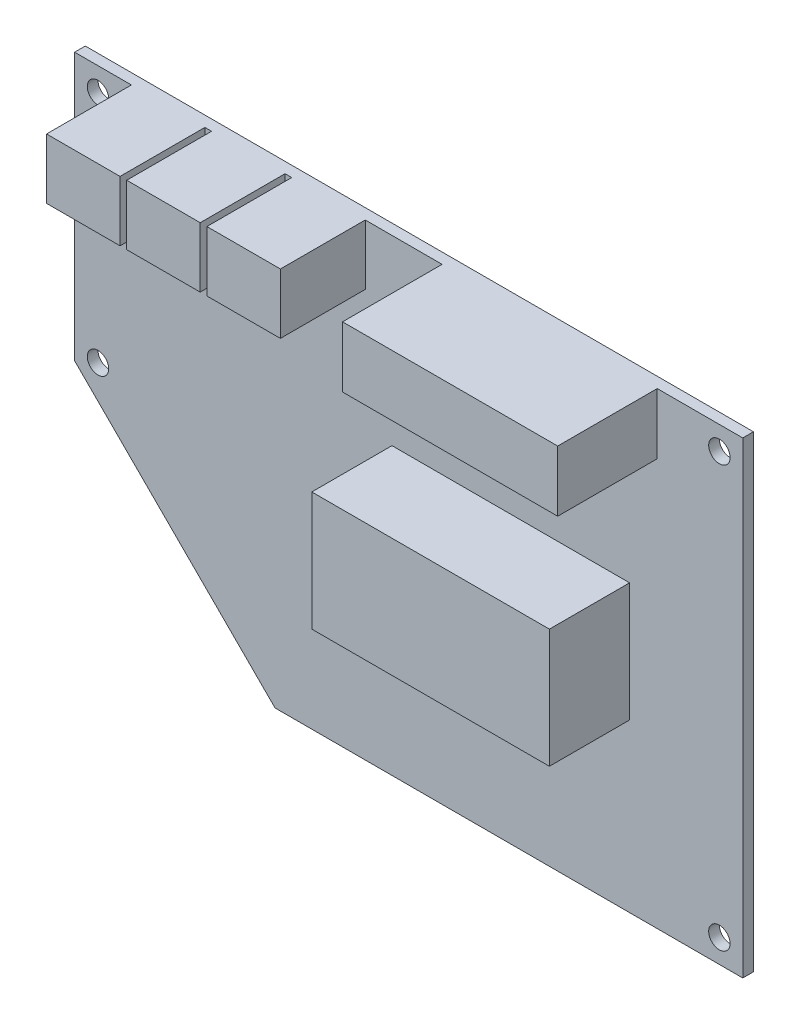
ISO-10303-21;
HEADER;
FILE_DESCRIPTION(('STEP AP214'),'2;1');
FILE_NAME('part.step','',(''),(''),'','','');
FILE_SCHEMA(('AUTOMOTIVE_DESIGN { 1 0 10303 214 1 1 1 1 }'));
ENDSEC;
DATA;
#1=APPLICATION_CONTEXT('core data for automotive mechanical design processes');
#2=APPLICATION_PROTOCOL_DEFINITION('international standard','automotive_design',2000,#1);
#3=PRODUCT_CONTEXT('',#1,'mechanical');
#4=PRODUCT('Part','Part','',(#3));
#5=PRODUCT_RELATED_PRODUCT_CATEGORY('part','',(#4));
#6=PRODUCT_DEFINITION_FORMATION('','',#4);
#7=PRODUCT_DEFINITION_CONTEXT('part definition',#1,'design');
#8=PRODUCT_DEFINITION('design','',#6,#7);
#9=PRODUCT_DEFINITION_SHAPE('','',#8);
#10=(LENGTH_UNIT() NAMED_UNIT(*) SI_UNIT(.MILLI.,.METRE.));
#11=(NAMED_UNIT(*) PLANE_ANGLE_UNIT() SI_UNIT($,.RADIAN.));
#12=(NAMED_UNIT(*) SI_UNIT($,.STERADIAN.) SOLID_ANGLE_UNIT());
#13=UNCERTAINTY_MEASURE_WITH_UNIT(LENGTH_MEASURE(1.E-05),#10,'distance_accuracy_value','');
#14=(GEOMETRIC_REPRESENTATION_CONTEXT(3) GLOBAL_UNCERTAINTY_ASSIGNED_CONTEXT((#13)) GLOBAL_UNIT_ASSIGNED_CONTEXT((#10,
#11,#12)) REPRESENTATION_CONTEXT('',''));
#15=CARTESIAN_POINT('',(0.,0.,0.));
#16=DIRECTION('',(0.,0.,1.));
#17=DIRECTION('',(1.,0.,0.));
#18=AXIS2_PLACEMENT_3D('',#15,#16,#17);
#19=CARTESIAN_POINT('',(0.,0.,1.6));
#20=DIRECTION('',(0.,0.,-1.));
#21=DIRECTION('',(-1.,0.,0.));
#22=AXIS2_PLACEMENT_3D('',#19,#20,#21);
#23=PLANE('',#22);
#24=DIRECTION('',(0.,-1.,0.));
#25=VECTOR('',#24,1.);
#26=CARTESIAN_POINT('',(55.,0.,1.6));
#27=LINE('',#26,#25);
#28=CARTESIAN_POINT('',(55.,0.,1.6));
#29=VERTEX_POINT('',#28);
#30=CARTESIAN_POINT('',(55.,-9.1,1.6));
#31=VERTEX_POINT('',#30);
#32=EDGE_CURVE('E231',#29,#31,#27,.T.);
#33=ORIENTED_EDGE('',*,*,#32,.F.);
#34=DIRECTION('',(-1.,0.,0.));
#35=VECTOR('',#34,1.);
#36=CARTESIAN_POINT('',(0.,0.,1.6));
#37=LINE('',#36,#35);
#38=CARTESIAN_POINT('',(43.5,0.,1.6));
#39=VERTEX_POINT('',#38);
#40=EDGE_CURVE('E453',#29,#39,#37,.T.);
#41=ORIENTED_EDGE('',*,*,#40,.T.);
#42=DIRECTION('',(0.,1.,0.));
#43=VECTOR('',#42,1.);
#44=CARTESIAN_POINT('',(43.5,0.,1.6));
#45=LINE('',#44,#43);
#46=CARTESIAN_POINT('',(43.5,-8.99999999999998,1.6));
#47=VERTEX_POINT('',#46);
#48=EDGE_CURVE('E284',#47,#39,#45,.T.);
#49=ORIENTED_EDGE('',*,*,#48,.F.);
#50=DIRECTION('',(1.,0.,0.));
#51=VECTOR('',#50,1.);
#52=CARTESIAN_POINT('',(32.5,-8.99999999999998,1.6));
#53=LINE('',#52,#51);
#54=CARTESIAN_POINT('',(32.5,-8.99999999999998,1.6));
#55=VERTEX_POINT('',#54);
#56=EDGE_CURVE('E297',#55,#47,#53,.T.);
#57=ORIENTED_EDGE('',*,*,#56,.F.);
#58=DIRECTION('',(0.,-1.,0.));
#59=VECTOR('',#58,1.);
#60=CARTESIAN_POINT('',(32.5,0.,1.6));
#61=LINE('',#60,#59);
#62=CARTESIAN_POINT('',(32.5,0.,1.6));
#63=VERTEX_POINT('',#62);
#64=EDGE_CURVE('E278',#63,#55,#61,.T.);
#65=ORIENTED_EDGE('',*,*,#64,.F.);
#66=CARTESIAN_POINT('',(31.5,0.,1.6));
#67=VERTEX_POINT('',#66);
#68=EDGE_CURVE('E520',#63,#67,#37,.T.);
#69=ORIENTED_EDGE('',*,*,#68,.T.);
#70=DIRECTION('',(0.,1.,0.));
#71=VECTOR('',#70,1.);
#72=CARTESIAN_POINT('',(31.5,0.,1.6));
#73=LINE('',#72,#71);
#74=CARTESIAN_POINT('',(31.5,-8.99999999999998,1.6));
#75=VERTEX_POINT('',#74);
#76=EDGE_CURVE('E325',#75,#67,#73,.T.);
#77=ORIENTED_EDGE('',*,*,#76,.F.);
#78=DIRECTION('',(1.,0.,0.));
#79=VECTOR('',#78,1.);
#80=CARTESIAN_POINT('',(20.5,-8.99999999999998,1.6));
#81=LINE('',#80,#79);
#82=CARTESIAN_POINT('',(20.5,-8.99999999999998,1.6));
#83=VERTEX_POINT('',#82);
#84=EDGE_CURVE('E338',#83,#75,#81,.T.);
#85=ORIENTED_EDGE('',*,*,#84,.F.);
#86=DIRECTION('',(0.,-1.,0.));
#87=VECTOR('',#86,1.);
#88=CARTESIAN_POINT('',(20.5,0.,1.6));
#89=LINE('',#88,#87);
#90=CARTESIAN_POINT('',(20.5,0.,1.6));
#91=VERTEX_POINT('',#90);
#92=EDGE_CURVE('E319',#91,#83,#89,.T.);
#93=ORIENTED_EDGE('',*,*,#92,.F.);
#94=CARTESIAN_POINT('',(19.5,0.,1.6));
#95=VERTEX_POINT('',#94);
#96=EDGE_CURVE('E522',#91,#95,#37,.T.);
#97=ORIENTED_EDGE('',*,*,#96,.T.);
#98=DIRECTION('',(0.,1.,0.));
#99=VECTOR('',#98,1.);
#100=CARTESIAN_POINT('',(19.5,0.,1.6));
#101=LINE('',#100,#99);
#102=CARTESIAN_POINT('',(19.5,-8.99999999999998,1.6));
#103=VERTEX_POINT('',#102);
#104=EDGE_CURVE('E366',#103,#95,#101,.T.);
#105=ORIENTED_EDGE('',*,*,#104,.F.);
#106=DIRECTION('',(1.,0.,0.));
#107=VECTOR('',#106,1.);
#108=CARTESIAN_POINT('',(8.5,-8.99999999999998,1.6));
#109=LINE('',#108,#107);
#110=CARTESIAN_POINT('',(8.5,-8.99999999999998,1.6));
#111=VERTEX_POINT('',#110);
#112=EDGE_CURVE('E379',#111,#103,#109,.T.);
#113=ORIENTED_EDGE('',*,*,#112,.F.);
#114=DIRECTION('',(0.,-1.,0.));
#115=VECTOR('',#114,1.);
#116=CARTESIAN_POINT('',(8.50000000000001,0.,1.6));
#117=LINE('',#116,#115);
#118=CARTESIAN_POINT('',(8.50000000000001,0.,1.6));
#119=VERTEX_POINT('',#118);
#120=EDGE_CURVE('E360',#119,#111,#117,.T.);
#121=ORIENTED_EDGE('',*,*,#120,.F.);
#122=CARTESIAN_POINT('',(0.,0.,1.6));
#123=VERTEX_POINT('',#122);
#124=EDGE_CURVE('E448',#119,#123,#37,.T.);
#125=ORIENTED_EDGE('',*,*,#124,.T.);
#126=DIRECTION('',(0.,-1.,0.));
#127=VECTOR('',#126,1.);
#128=CARTESIAN_POINT('',(0.,-40.,1.6));
#129=LINE('',#128,#127);
#130=CARTESIAN_POINT('',(0.,-40.,1.6));
#131=VERTEX_POINT('',#130);
#132=EDGE_CURVE('E434',#123,#131,#129,.T.);
#133=ORIENTED_EDGE('',*,*,#132,.T.);
#134=DIRECTION('',(0.707106781186547,-0.707106781186548,0.));
#135=VECTOR('',#134,1.);
#136=CARTESIAN_POINT('',(30.,-70.,1.6));
#137=LINE('',#136,#135);
#138=CARTESIAN_POINT('',(30.,-70.,1.6));
#139=VERTEX_POINT('',#138);
#140=EDGE_CURVE('E438',#131,#139,#137,.T.);
#141=ORIENTED_EDGE('',*,*,#140,.T.);
#142=DIRECTION('',(1.,0.,0.));
#143=VECTOR('',#142,1.);
#144=CARTESIAN_POINT('',(100.,-70.,1.6));
#145=LINE('',#144,#143);
#146=CARTESIAN_POINT('',(100.,-70.,1.6));
#147=VERTEX_POINT('',#146);
#148=EDGE_CURVE('E442',#139,#147,#145,.T.);
#149=ORIENTED_EDGE('',*,*,#148,.T.);
#150=DIRECTION('',(0.,1.,0.));
#151=VECTOR('',#150,1.);
#152=CARTESIAN_POINT('',(100.,0.,1.6));
#153=LINE('',#152,#151);
#154=CARTESIAN_POINT('',(100.,0.,1.6));
#155=VERTEX_POINT('',#154);
#156=EDGE_CURVE('E445',#147,#155,#153,.T.);
#157=ORIENTED_EDGE('',*,*,#156,.T.);
#158=CARTESIAN_POINT('',(87.2,0.,1.6));
#159=VERTEX_POINT('',#158);
#160=EDGE_CURVE('E449',#155,#159,#37,.T.);
#161=ORIENTED_EDGE('',*,*,#160,.T.);
#162=DIRECTION('',(0.,1.,0.));
#163=VECTOR('',#162,1.);
#164=CARTESIAN_POINT('',(87.2,0.,1.6));
#165=LINE('',#164,#163);
#166=CARTESIAN_POINT('',(87.2,-9.1,1.6));
#167=VERTEX_POINT('',#166);
#168=EDGE_CURVE('E247',#167,#159,#165,.T.);
#169=ORIENTED_EDGE('',*,*,#168,.F.);
#170=DIRECTION('',(1.,0.,0.));
#171=VECTOR('',#170,1.);
#172=CARTESIAN_POINT('',(55.,-9.1,1.6));
#173=LINE('',#172,#171);
#174=EDGE_CURVE('E236',#31,#167,#173,.T.);
#175=ORIENTED_EDGE('',*,*,#174,.F.);
#176=EDGE_LOOP('',(#33,#41,#49,#57,#65,#69,#77,#85,#93,#97,#105,#113,#121,#125,#133,#141,#149,
#157,#161,#169,#175));
#177=FACE_BOUND('',#176,.T.);
#178=CARTESIAN_POINT('',(96.5,-66.5,1.6));
#179=DIRECTION('',(0.,0.,1.));
#180=DIRECTION('',(1.,0.,0.));
#181=AXIS2_PLACEMENT_3D('',#178,#179,#180);
#182=CIRCLE('',#181,1.60000000000001);
#183=CARTESIAN_POINT('',(98.1,-66.5,1.6));
#184=VERTEX_POINT('',#183);
#185=EDGE_CURVE('E402',#184,#184,#182,.T.);
#186=ORIENTED_EDGE('',*,*,#185,.F.);
#187=EDGE_LOOP('',(#186));
#188=FACE_BOUND('',#187,.T.);
#189=CARTESIAN_POINT('',(3.5,-38.5,1.6));
#190=DIRECTION('',(0.,0.,1.));
#191=DIRECTION('',(1.,0.,0.));
#192=AXIS2_PLACEMENT_3D('',#189,#190,#191);
#193=CIRCLE('',#192,1.59999999999999);
#194=CARTESIAN_POINT('',(5.1,-38.5,1.6));
#195=VERTEX_POINT('',#194);
#196=EDGE_CURVE('E410',#195,#195,#193,.T.);
#197=ORIENTED_EDGE('',*,*,#196,.F.);
#198=EDGE_LOOP('',(#197));
#199=FACE_BOUND('',#198,.T.);
#200=CARTESIAN_POINT('',(96.5,-3.5,1.6));
#201=DIRECTION('',(0.,0.,1.));
#202=DIRECTION('',(1.,0.,0.));
#203=AXIS2_PLACEMENT_3D('',#200,#201,#202);
#204=CIRCLE('',#203,1.60000000000001);
#205=CARTESIAN_POINT('',(98.1,-3.5,1.6));
#206=VERTEX_POINT('',#205);
#207=EDGE_CURVE('E418',#206,#206,#204,.T.);
#208=ORIENTED_EDGE('',*,*,#207,.F.);
#209=EDGE_LOOP('',(#208));
#210=FACE_BOUND('',#209,.T.);
#211=CARTESIAN_POINT('',(3.5,-3.5,1.6));
#212=DIRECTION('',(0.,0.,1.));
#213=DIRECTION('',(1.,0.,0.));
#214=AXIS2_PLACEMENT_3D('',#211,#212,#213);
#215=CIRCLE('',#214,1.6);
#216=CARTESIAN_POINT('',(5.1,-3.5,1.6));
#217=VERTEX_POINT('',#216);
#218=EDGE_CURVE('E426',#217,#217,#215,.T.);
#219=ORIENTED_EDGE('',*,*,#218,.F.);
#220=EDGE_LOOP('',(#219));
#221=FACE_BOUND('',#220,.T.);
#222=DIRECTION('',(0.,-1.,0.));
#223=VECTOR('',#222,1.);
#224=CARTESIAN_POINT('',(47.5,-27.25,1.6));
#225=LINE('',#224,#223);
#226=CARTESIAN_POINT('',(47.5,-27.25,1.6));
#227=VERTEX_POINT('',#226);
#228=CARTESIAN_POINT('',(47.5,-45.03,1.6));
#229=VERTEX_POINT('',#228);
#230=EDGE_CURVE('E229',#227,#229,#225,.T.);
#231=ORIENTED_EDGE('',*,*,#230,.F.);
#232=DIRECTION('',(-1.,0.,0.));
#233=VECTOR('',#232,1.);
#234=CARTESIAN_POINT('',(47.5,-27.25,1.6));
#235=LINE('',#234,#233);
#236=CARTESIAN_POINT('',(83.06,-27.25,1.6));
#237=VERTEX_POINT('',#236);
#238=EDGE_CURVE('E226',#237,#227,#235,.T.);
#239=ORIENTED_EDGE('',*,*,#238,.F.);
#240=DIRECTION('',(0.,1.,0.));
#241=VECTOR('',#240,1.);
#242=CARTESIAN_POINT('',(83.06,-27.25,1.6));
#243=LINE('',#242,#241);
#244=CARTESIAN_POINT('',(83.06,-45.03,1.6));
#245=VERTEX_POINT('',#244);
#246=EDGE_CURVE('E60',#245,#237,#243,.T.);
#247=ORIENTED_EDGE('',*,*,#246,.F.);
#248=DIRECTION('',(1.,0.,0.));
#249=VECTOR('',#248,1.);
#250=CARTESIAN_POINT('',(47.5,-45.03,1.6));
#251=LINE('',#250,#249);
#252=EDGE_CURVE('E55',#229,#245,#251,.T.);
#253=ORIENTED_EDGE('',*,*,#252,.F.);
#254=EDGE_LOOP('',(#231,#239,#247,#253));
#255=FACE_BOUND('',#254,.T.);
#256=ADVANCED_FACE('F39',(#177,#188,#199,#210,#221,#255),#23,.F.);
#257=CARTESIAN_POINT('',(0.,0.,0.));
#258=DIRECTION('',(0.,0.,-1.));
#259=DIRECTION('',(-1.,0.,0.));
#260=AXIS2_PLACEMENT_3D('',#257,#258,#259);
#261=PLANE('',#260);
#262=CARTESIAN_POINT('',(3.5,-38.5,0.));
#263=DIRECTION('',(0.,0.,1.));
#264=DIRECTION('',(1.,0.,0.));
#265=AXIS2_PLACEMENT_3D('',#262,#263,#264);
#266=CIRCLE('',#265,1.59999999999999);
#267=CARTESIAN_POINT('',(5.1,-38.5,0.));
#268=VERTEX_POINT('',#267);
#269=EDGE_CURVE('E406',#268,#268,#266,.T.);
#270=ORIENTED_EDGE('',*,*,#269,.T.);
#271=EDGE_LOOP('',(#270));
#272=FACE_BOUND('',#271,.T.);
#273=CARTESIAN_POINT('',(3.5,-3.5,0.));
#274=DIRECTION('',(0.,0.,1.));
#275=DIRECTION('',(1.,0.,0.));
#276=AXIS2_PLACEMENT_3D('',#273,#274,#275);
#277=CIRCLE('',#276,1.6);
#278=CARTESIAN_POINT('',(5.1,-3.5,0.));
#279=VERTEX_POINT('',#278);
#280=EDGE_CURVE('E422',#279,#279,#277,.T.);
#281=ORIENTED_EDGE('',*,*,#280,.T.);
#282=EDGE_LOOP('',(#281));
#283=FACE_BOUND('',#282,.T.);
#284=DIRECTION('',(0.,-1.,0.));
#285=VECTOR('',#284,1.);
#286=CARTESIAN_POINT('',(0.,-40.,0.));
#287=LINE('',#286,#285);
#288=CARTESIAN_POINT('',(0.,0.,0.));
#289=VERTEX_POINT('',#288);
#290=CARTESIAN_POINT('',(0.,-40.,0.));
#291=VERTEX_POINT('',#290);
#292=EDGE_CURVE('E430',#289,#291,#287,.T.);
#293=ORIENTED_EDGE('',*,*,#292,.F.);
#294=DIRECTION('',(-1.,0.,0.));
#295=VECTOR('',#294,1.);
#296=CARTESIAN_POINT('',(0.,0.,0.));
#297=LINE('',#296,#295);
#298=CARTESIAN_POINT('',(100.,0.,0.));
#299=VERTEX_POINT('',#298);
#300=EDGE_CURVE('E439',#299,#289,#297,.T.);
#301=ORIENTED_EDGE('',*,*,#300,.F.);
#302=DIRECTION('',(0.,1.,0.));
#303=VECTOR('',#302,1.);
#304=CARTESIAN_POINT('',(100.,0.,0.));
#305=LINE('',#304,#303);
#306=CARTESIAN_POINT('',(100.,-70.,0.));
#307=VERTEX_POINT('',#306);
#308=EDGE_CURVE('E463',#307,#299,#305,.T.);
#309=ORIENTED_EDGE('',*,*,#308,.F.);
#310=DIRECTION('',(1.,0.,0.));
#311=VECTOR('',#310,1.);
#312=CARTESIAN_POINT('',(100.,-70.,0.));
#313=LINE('',#312,#311);
#314=CARTESIAN_POINT('',(30.,-70.,0.));
#315=VERTEX_POINT('',#314);
#316=EDGE_CURVE('E460',#315,#307,#313,.T.);
#317=ORIENTED_EDGE('',*,*,#316,.F.);
#318=DIRECTION('',(0.707106781186547,-0.707106781186548,0.));
#319=VECTOR('',#318,1.);
#320=CARTESIAN_POINT('',(30.,-70.,0.));
#321=LINE('',#320,#319);
#322=EDGE_CURVE('E457',#291,#315,#321,.T.);
#323=ORIENTED_EDGE('',*,*,#322,.F.);
#324=EDGE_LOOP('',(#293,#301,#309,#317,#323));
#325=FACE_BOUND('',#324,.T.);
#326=CARTESIAN_POINT('',(96.5,-3.5,0.));
#327=DIRECTION('',(0.,0.,1.));
#328=DIRECTION('',(1.,0.,0.));
#329=AXIS2_PLACEMENT_3D('',#326,#327,#328);
#330=CIRCLE('',#329,1.60000000000001);
#331=CARTESIAN_POINT('',(98.1,-3.5,0.));
#332=VERTEX_POINT('',#331);
#333=EDGE_CURVE('E414',#332,#332,#330,.T.);
#334=ORIENTED_EDGE('',*,*,#333,.T.);
#335=EDGE_LOOP('',(#334));
#336=FACE_BOUND('',#335,.T.);
#337=CARTESIAN_POINT('',(96.5,-66.5,0.));
#338=DIRECTION('',(0.,0.,1.));
#339=DIRECTION('',(1.,0.,0.));
#340=AXIS2_PLACEMENT_3D('',#337,#338,#339);
#341=CIRCLE('',#340,1.60000000000001);
#342=CARTESIAN_POINT('',(98.1,-66.5,0.));
#343=VERTEX_POINT('',#342);
#344=EDGE_CURVE('E401',#343,#343,#341,.T.);
#345=ORIENTED_EDGE('',*,*,#344,.T.);
#346=EDGE_LOOP('',(#345));
#347=FACE_BOUND('',#346,.T.);
#348=ADVANCED_FACE('F490',(#272,#283,#325,#336,#347),#261,.T.);
#349=CARTESIAN_POINT('',(0.,-40.,1.6));
#350=DIRECTION('',(1.,0.,0.));
#351=DIRECTION('',(0.,0.,-1.));
#352=AXIS2_PLACEMENT_3D('',#349,#350,#351);
#353=PLANE('',#352);
#354=ORIENTED_EDGE('',*,*,#292,.T.);
#355=DIRECTION('',(0.,0.,-1.));
#356=VECTOR('',#355,1.);
#357=CARTESIAN_POINT('',(0.,-40.,1.6));
#358=LINE('',#357,#356);
#359=EDGE_CURVE('E11',#131,#291,#358,.T.);
#360=ORIENTED_EDGE('',*,*,#359,.F.);
#361=ORIENTED_EDGE('',*,*,#132,.F.);
#362=DIRECTION('',(0.,0.,-1.));
#363=VECTOR('',#362,1.);
#364=CARTESIAN_POINT('',(0.,0.,1.6));
#365=LINE('',#364,#363);
#366=EDGE_CURVE('E452',#123,#289,#365,.T.);
#367=ORIENTED_EDGE('',*,*,#366,.T.);
#368=EDGE_LOOP('',(#354,#360,#361,#367));
#369=FACE_BOUND('',#368,.T.);
#370=ADVANCED_FACE('F41',(#369),#353,.F.);
#371=CARTESIAN_POINT('',(30.,-70.,1.6));
#372=DIRECTION('',(0.707106781186548,0.707106781186547,0.));
#373=DIRECTION('',(-0.707106781186547,0.707106781186548,0.));
#374=AXIS2_PLACEMENT_3D('',#371,#372,#373);
#375=PLANE('',#374);
#376=ORIENTED_EDGE('',*,*,#322,.T.);
#377=DIRECTION('',(0.,0.,-1.));
#378=VECTOR('',#377,1.);
#379=CARTESIAN_POINT('',(30.,-70.,1.6));
#380=LINE('',#379,#378);
#381=EDGE_CURVE('E48',#139,#315,#380,.T.);
#382=ORIENTED_EDGE('',*,*,#381,.F.);
#383=ORIENTED_EDGE('',*,*,#140,.F.);
#384=ORIENTED_EDGE('',*,*,#359,.T.);
#385=EDGE_LOOP('',(#376,#382,#383,#384));
#386=FACE_BOUND('',#385,.T.);
#387=ADVANCED_FACE('F532',(#386),#375,.F.);
#388=CARTESIAN_POINT('',(100.,-70.,1.6));
#389=DIRECTION('',(0.,1.,0.));
#390=DIRECTION('',(-1.,0.,0.));
#391=AXIS2_PLACEMENT_3D('',#388,#389,#390);
#392=PLANE('',#391);
#393=ORIENTED_EDGE('',*,*,#316,.T.);
#394=DIRECTION('',(0.,0.,-1.));
#395=VECTOR('',#394,1.);
#396=CARTESIAN_POINT('',(100.,-70.,1.6));
#397=LINE('',#396,#395);
#398=EDGE_CURVE('E475',#147,#307,#397,.T.);
#399=ORIENTED_EDGE('',*,*,#398,.F.);
#400=ORIENTED_EDGE('',*,*,#148,.F.);
#401=ORIENTED_EDGE('',*,*,#381,.T.);
#402=EDGE_LOOP('',(#393,#399,#400,#401));
#403=FACE_BOUND('',#402,.T.);
#404=ADVANCED_FACE('F484',(#403),#392,.F.);
#405=CARTESIAN_POINT('',(100.,0.,1.6));
#406=DIRECTION('',(-1.,0.,0.));
#407=DIRECTION('',(0.,-1.,0.));
#408=AXIS2_PLACEMENT_3D('',#405,#406,#407);
#409=PLANE('',#408);
#410=ORIENTED_EDGE('',*,*,#308,.T.);
#411=DIRECTION('',(0.,0.,-1.));
#412=VECTOR('',#411,1.);
#413=CARTESIAN_POINT('',(100.,0.,1.6));
#414=LINE('',#413,#412);
#415=EDGE_CURVE('E471',#155,#299,#414,.T.);
#416=ORIENTED_EDGE('',*,*,#415,.F.);
#417=ORIENTED_EDGE('',*,*,#156,.F.);
#418=ORIENTED_EDGE('',*,*,#398,.T.);
#419=EDGE_LOOP('',(#410,#416,#417,#418));
#420=FACE_BOUND('',#419,.T.);
#421=ADVANCED_FACE('F495',(#420),#409,.F.);
#422=CARTESIAN_POINT('',(0.,0.,1.6));
#423=DIRECTION('',(0.,-1.,0.));
#424=DIRECTION('',(0.,0.,-1.));
#425=AXIS2_PLACEMENT_3D('',#422,#423,#424);
#426=PLANE('',#425);
#427=ORIENTED_EDGE('',*,*,#300,.T.);
#428=ORIENTED_EDGE('',*,*,#366,.F.);
#429=ORIENTED_EDGE('',*,*,#124,.F.);
#430=DIRECTION('',(0.,0.,-1.));
#431=VECTOR('',#430,1.);
#432=CARTESIAN_POINT('',(8.50000000000001,0.,14.3));
#433=LINE('',#432,#431);
#434=CARTESIAN_POINT('',(8.50000000000001,0.,14.3));
#435=VERTEX_POINT('',#434);
#436=EDGE_CURVE('E375',#435,#119,#433,.T.);
#437=ORIENTED_EDGE('',*,*,#436,.F.);
#438=DIRECTION('',(-1.,0.,0.));
#439=VECTOR('',#438,1.);
#440=CARTESIAN_POINT('',(8.50000000000001,0.,14.3));
#441=LINE('',#440,#439);
#442=CARTESIAN_POINT('',(19.5,0.,14.3));
#443=VERTEX_POINT('',#442);
#444=EDGE_CURVE('E372',#443,#435,#441,.T.);
#445=ORIENTED_EDGE('',*,*,#444,.F.);
#446=DIRECTION('',(0.,0.,-1.));
#447=VECTOR('',#446,1.);
#448=CARTESIAN_POINT('',(19.5,0.,14.3));
#449=LINE('',#448,#447);
#450=EDGE_CURVE('E389',#443,#95,#449,.T.);
#451=ORIENTED_EDGE('',*,*,#450,.T.);
#452=ORIENTED_EDGE('',*,*,#96,.F.);
#453=DIRECTION('',(0.,0.,-1.));
#454=VECTOR('',#453,1.);
#455=CARTESIAN_POINT('',(20.5,0.,14.3));
#456=LINE('',#455,#454);
#457=CARTESIAN_POINT('',(20.5,0.,14.3));
#458=VERTEX_POINT('',#457);
#459=EDGE_CURVE('E334',#458,#91,#456,.T.);
#460=ORIENTED_EDGE('',*,*,#459,.F.);
#461=DIRECTION('',(-1.,0.,0.));
#462=VECTOR('',#461,1.);
#463=CARTESIAN_POINT('',(20.5,0.,14.3));
#464=LINE('',#463,#462);
#465=CARTESIAN_POINT('',(31.5,0.,14.3));
#466=VERTEX_POINT('',#465);
#467=EDGE_CURVE('E331',#466,#458,#464,.T.);
#468=ORIENTED_EDGE('',*,*,#467,.F.);
#469=DIRECTION('',(0.,0.,-1.));
#470=VECTOR('',#469,1.);
#471=CARTESIAN_POINT('',(31.5,0.,14.3));
#472=LINE('',#471,#470);
#473=EDGE_CURVE('E348',#466,#67,#472,.T.);
#474=ORIENTED_EDGE('',*,*,#473,.T.);
#475=ORIENTED_EDGE('',*,*,#68,.F.);
#476=DIRECTION('',(0.,0.,-1.));
#477=VECTOR('',#476,1.);
#478=CARTESIAN_POINT('',(32.5,0.,14.3));
#479=LINE('',#478,#477);
#480=CARTESIAN_POINT('',(32.5,0.,14.3));
#481=VERTEX_POINT('',#480);
#482=EDGE_CURVE('E293',#481,#63,#479,.T.);
#483=ORIENTED_EDGE('',*,*,#482,.F.);
#484=DIRECTION('',(-1.,0.,0.));
#485=VECTOR('',#484,1.);
#486=CARTESIAN_POINT('',(32.5,0.,14.3));
#487=LINE('',#486,#485);
#488=CARTESIAN_POINT('',(43.5,0.,14.3));
#489=VERTEX_POINT('',#488);
#490=EDGE_CURVE('E290',#489,#481,#487,.T.);
#491=ORIENTED_EDGE('',*,*,#490,.F.);
#492=DIRECTION('',(0.,0.,-1.));
#493=VECTOR('',#492,1.);
#494=CARTESIAN_POINT('',(43.5,0.,14.3));
#495=LINE('',#494,#493);
#496=EDGE_CURVE('E307',#489,#39,#495,.T.);
#497=ORIENTED_EDGE('',*,*,#496,.T.);
#498=ORIENTED_EDGE('',*,*,#40,.F.);
#499=DIRECTION('',(0.,0.,-1.));
#500=VECTOR('',#499,1.);
#501=CARTESIAN_POINT('',(55.,0.,16.5));
#502=LINE('',#501,#500);
#503=CARTESIAN_POINT('',(55.,0.,16.5));
#504=VERTEX_POINT('',#503);
#505=EDGE_CURVE('E255',#504,#29,#502,.T.);
#506=ORIENTED_EDGE('',*,*,#505,.F.);
#507=DIRECTION('',(-1.,0.,0.));
#508=VECTOR('',#507,1.);
#509=CARTESIAN_POINT('',(55.,0.,16.5));
#510=LINE('',#509,#508);
#511=CARTESIAN_POINT('',(87.2,0.,16.5));
#512=VERTEX_POINT('',#511);
#513=EDGE_CURVE('E253',#512,#504,#510,.T.);
#514=ORIENTED_EDGE('',*,*,#513,.F.);
#515=DIRECTION('',(0.,0.,-1.));
#516=VECTOR('',#515,1.);
#517=CARTESIAN_POINT('',(87.2,0.,16.5));
#518=LINE('',#517,#516);
#519=EDGE_CURVE('E266',#512,#159,#518,.T.);
#520=ORIENTED_EDGE('',*,*,#519,.T.);
#521=ORIENTED_EDGE('',*,*,#160,.F.);
#522=ORIENTED_EDGE('',*,*,#415,.T.);
#523=EDGE_LOOP('',(#427,#428,#429,#437,#445,#451,#452,#460,#468,#474,#475,#483,#491,#497,#498,
#506,#514,#520,#521,#522));
#524=FACE_BOUND('',#523,.T.);
#525=ADVANCED_FACE('F499',(#524),#426,.F.);
#526=CARTESIAN_POINT('',(3.5,-3.5,1.6));
#527=DIRECTION('',(0.,0.,-1.));
#528=DIRECTION('',(-1.,0.,0.));
#529=AXIS2_PLACEMENT_3D('',#526,#527,#528);
#530=CYLINDRICAL_SURFACE('',#529,1.6);
#531=ORIENTED_EDGE('',*,*,#218,.T.);
#532=EDGE_LOOP('',(#531));
#533=FACE_BOUND('',#532,.T.);
#534=ORIENTED_EDGE('',*,*,#280,.F.);
#535=EDGE_LOOP('',(#534));
#536=FACE_BOUND('',#535,.T.);
#537=ADVANCED_FACE('F549',(#533,#536),#530,.F.);
#538=CARTESIAN_POINT('',(96.5,-3.5,1.6));
#539=DIRECTION('',(0.,0.,-1.));
#540=DIRECTION('',(-1.,0.,0.));
#541=AXIS2_PLACEMENT_3D('',#538,#539,#540);
#542=CYLINDRICAL_SURFACE('',#541,1.60000000000001);
#543=ORIENTED_EDGE('',*,*,#207,.T.);
#544=EDGE_LOOP('',(#543));
#545=FACE_BOUND('',#544,.T.);
#546=ORIENTED_EDGE('',*,*,#333,.F.);
#547=EDGE_LOOP('',(#546));
#548=FACE_BOUND('',#547,.T.);
#549=ADVANCED_FACE('F571',(#545,#548),#542,.F.);
#550=CARTESIAN_POINT('',(3.5,-38.5,1.6));
#551=DIRECTION('',(0.,0.,-1.));
#552=DIRECTION('',(-1.,0.,0.));
#553=AXIS2_PLACEMENT_3D('',#550,#551,#552);
#554=CYLINDRICAL_SURFACE('',#553,1.59999999999999);
#555=ORIENTED_EDGE('',*,*,#196,.T.);
#556=EDGE_LOOP('',(#555));
#557=FACE_BOUND('',#556,.T.);
#558=ORIENTED_EDGE('',*,*,#269,.F.);
#559=EDGE_LOOP('',(#558));
#560=FACE_BOUND('',#559,.T.);
#561=ADVANCED_FACE('F578',(#557,#560),#554,.F.);
#562=CARTESIAN_POINT('',(96.5,-66.5,1.6));
#563=DIRECTION('',(0.,0.,-1.));
#564=DIRECTION('',(-1.,0.,0.));
#565=AXIS2_PLACEMENT_3D('',#562,#563,#564);
#566=CYLINDRICAL_SURFACE('',#565,1.60000000000001);
#567=ORIENTED_EDGE('',*,*,#185,.T.);
#568=EDGE_LOOP('',(#567));
#569=FACE_BOUND('',#568,.T.);
#570=ORIENTED_EDGE('',*,*,#344,.F.);
#571=EDGE_LOOP('',(#570));
#572=FACE_BOUND('',#571,.T.);
#573=ADVANCED_FACE('F585',(#569,#572),#566,.F.);
#574=CARTESIAN_POINT('',(8.50000000000001,0.,14.3));
#575=DIRECTION('',(1.,0.,0.));
#576=DIRECTION('',(0.,1.,0.));
#577=AXIS2_PLACEMENT_3D('',#574,#575,#576);
#578=PLANE('',#577);
#579=ORIENTED_EDGE('',*,*,#120,.T.);
#580=DIRECTION('',(0.,0.,-1.));
#581=VECTOR('',#580,1.);
#582=CARTESIAN_POINT('',(8.5,-8.99999999999998,14.3));
#583=LINE('',#582,#581);
#584=CARTESIAN_POINT('',(8.5,-8.99999999999998,14.3));
#585=VERTEX_POINT('',#584);
#586=EDGE_CURVE('E397',#585,#111,#583,.T.);
#587=ORIENTED_EDGE('',*,*,#586,.F.);
#588=DIRECTION('',(0.,-1.,0.));
#589=VECTOR('',#588,1.);
#590=CARTESIAN_POINT('',(8.50000000000001,0.,14.3));
#591=LINE('',#590,#589);
#592=EDGE_CURVE('E361',#435,#585,#591,.T.);
#593=ORIENTED_EDGE('',*,*,#592,.F.);
#594=ORIENTED_EDGE('',*,*,#436,.T.);
#595=EDGE_LOOP('',(#579,#587,#593,#594));
#596=FACE_BOUND('',#595,.T.);
#597=ADVANCED_FACE('F593',(#596),#578,.F.);
#598=CARTESIAN_POINT('',(8.5,-8.99999999999998,14.3));
#599=DIRECTION('',(0.,1.,0.));
#600=DIRECTION('',(-1.,0.,0.));
#601=AXIS2_PLACEMENT_3D('',#598,#599,#600);
#602=PLANE('',#601);
#603=ORIENTED_EDGE('',*,*,#112,.T.);
#604=DIRECTION('',(0.,0.,-1.));
#605=VECTOR('',#604,1.);
#606=CARTESIAN_POINT('',(19.5,-8.99999999999998,14.3));
#607=LINE('',#606,#605);
#608=CARTESIAN_POINT('',(19.5,-8.99999999999998,14.3));
#609=VERTEX_POINT('',#608);
#610=EDGE_CURVE('E393',#609,#103,#607,.T.);
#611=ORIENTED_EDGE('',*,*,#610,.F.);
#612=DIRECTION('',(1.,0.,0.));
#613=VECTOR('',#612,1.);
#614=CARTESIAN_POINT('',(8.5,-8.99999999999998,14.3));
#615=LINE('',#614,#613);
#616=EDGE_CURVE('E365',#585,#609,#615,.T.);
#617=ORIENTED_EDGE('',*,*,#616,.F.);
#618=ORIENTED_EDGE('',*,*,#586,.T.);
#619=EDGE_LOOP('',(#603,#611,#617,#618));
#620=FACE_BOUND('',#619,.T.);
#621=ADVANCED_FACE('F601',(#620),#602,.F.);
#622=CARTESIAN_POINT('',(19.5,0.,14.3));
#623=DIRECTION('',(-1.,0.,0.));
#624=DIRECTION('',(0.,-1.,0.));
#625=AXIS2_PLACEMENT_3D('',#622,#623,#624);
#626=PLANE('',#625);
#627=ORIENTED_EDGE('',*,*,#104,.T.);
#628=ORIENTED_EDGE('',*,*,#450,.F.);
#629=DIRECTION('',(0.,1.,0.));
#630=VECTOR('',#629,1.);
#631=CARTESIAN_POINT('',(19.5,0.,14.3));
#632=LINE('',#631,#630);
#633=EDGE_CURVE('E369',#609,#443,#632,.T.);
#634=ORIENTED_EDGE('',*,*,#633,.F.);
#635=ORIENTED_EDGE('',*,*,#610,.T.);
#636=EDGE_LOOP('',(#627,#628,#634,#635));
#637=FACE_BOUND('',#636,.T.);
#638=ADVANCED_FACE('F609',(#637),#626,.F.);
#639=CARTESIAN_POINT('',(0.,0.,14.3));
#640=DIRECTION('',(0.,0.,1.));
#641=DIRECTION('',(1.,0.,0.));
#642=AXIS2_PLACEMENT_3D('',#639,#640,#641);
#643=PLANE('',#642);
#644=ORIENTED_EDGE('',*,*,#592,.T.);
#645=ORIENTED_EDGE('',*,*,#616,.T.);
#646=ORIENTED_EDGE('',*,*,#633,.T.);
#647=ORIENTED_EDGE('',*,*,#444,.T.);
#648=EDGE_LOOP('',(#644,#645,#646,#647));
#649=FACE_BOUND('',#648,.T.);
#650=ADVANCED_FACE('F617',(#649),#643,.T.);
#651=CARTESIAN_POINT('',(20.5,0.,14.3));
#652=DIRECTION('',(1.,0.,0.));
#653=DIRECTION('',(0.,1.,0.));
#654=AXIS2_PLACEMENT_3D('',#651,#652,#653);
#655=PLANE('',#654);
#656=ORIENTED_EDGE('',*,*,#92,.T.);
#657=DIRECTION('',(0.,0.,-1.));
#658=VECTOR('',#657,1.);
#659=CARTESIAN_POINT('',(20.5,-8.99999999999998,14.3));
#660=LINE('',#659,#658);
#661=CARTESIAN_POINT('',(20.5,-8.99999999999998,14.3));
#662=VERTEX_POINT('',#661);
#663=EDGE_CURVE('E356',#662,#83,#660,.T.);
#664=ORIENTED_EDGE('',*,*,#663,.F.);
#665=DIRECTION('',(0.,-1.,0.));
#666=VECTOR('',#665,1.);
#667=CARTESIAN_POINT('',(20.5,0.,14.3));
#668=LINE('',#667,#666);
#669=EDGE_CURVE('E320',#458,#662,#668,.T.);
#670=ORIENTED_EDGE('',*,*,#669,.F.);
#671=ORIENTED_EDGE('',*,*,#459,.T.);
#672=EDGE_LOOP('',(#656,#664,#670,#671));
#673=FACE_BOUND('',#672,.T.);
#674=ADVANCED_FACE('F625',(#673),#655,.F.);
#675=CARTESIAN_POINT('',(20.5,-8.99999999999998,14.3));
#676=DIRECTION('',(0.,1.,0.));
#677=DIRECTION('',(-1.,0.,0.));
#678=AXIS2_PLACEMENT_3D('',#675,#676,#677);
#679=PLANE('',#678);
#680=ORIENTED_EDGE('',*,*,#84,.T.);
#681=DIRECTION('',(0.,0.,-1.));
#682=VECTOR('',#681,1.);
#683=CARTESIAN_POINT('',(31.5,-8.99999999999998,14.3));
#684=LINE('',#683,#682);
#685=CARTESIAN_POINT('',(31.5,-8.99999999999998,14.3));
#686=VERTEX_POINT('',#685);
#687=EDGE_CURVE('E352',#686,#75,#684,.T.);
#688=ORIENTED_EDGE('',*,*,#687,.F.);
#689=DIRECTION('',(1.,0.,0.));
#690=VECTOR('',#689,1.);
#691=CARTESIAN_POINT('',(20.5,-8.99999999999998,14.3));
#692=LINE('',#691,#690);
#693=EDGE_CURVE('E324',#662,#686,#692,.T.);
#694=ORIENTED_EDGE('',*,*,#693,.F.);
#695=ORIENTED_EDGE('',*,*,#663,.T.);
#696=EDGE_LOOP('',(#680,#688,#694,#695));
#697=FACE_BOUND('',#696,.T.);
#698=ADVANCED_FACE('F633',(#697),#679,.F.);
#699=CARTESIAN_POINT('',(31.5,0.,14.3));
#700=DIRECTION('',(-1.,0.,0.));
#701=DIRECTION('',(0.,0.,1.));
#702=AXIS2_PLACEMENT_3D('',#699,#700,#701);
#703=PLANE('',#702);
#704=ORIENTED_EDGE('',*,*,#76,.T.);
#705=ORIENTED_EDGE('',*,*,#473,.F.);
#706=DIRECTION('',(0.,1.,0.));
#707=VECTOR('',#706,1.);
#708=CARTESIAN_POINT('',(31.5,0.,14.3));
#709=LINE('',#708,#707);
#710=EDGE_CURVE('E328',#686,#466,#709,.T.);
#711=ORIENTED_EDGE('',*,*,#710,.F.);
#712=ORIENTED_EDGE('',*,*,#687,.T.);
#713=EDGE_LOOP('',(#704,#705,#711,#712));
#714=FACE_BOUND('',#713,.T.);
#715=ADVANCED_FACE('F641',(#714),#703,.F.);
#716=CARTESIAN_POINT('',(0.,0.,14.3));
#717=DIRECTION('',(0.,0.,1.));
#718=DIRECTION('',(1.,0.,0.));
#719=AXIS2_PLACEMENT_3D('',#716,#717,#718);
#720=PLANE('',#719);
#721=ORIENTED_EDGE('',*,*,#669,.T.);
#722=ORIENTED_EDGE('',*,*,#693,.T.);
#723=ORIENTED_EDGE('',*,*,#710,.T.);
#724=ORIENTED_EDGE('',*,*,#467,.T.);
#725=EDGE_LOOP('',(#721,#722,#723,#724));
#726=FACE_BOUND('',#725,.T.);
#727=ADVANCED_FACE('F649',(#726),#720,.T.);
#728=CARTESIAN_POINT('',(32.5,0.,14.3));
#729=DIRECTION('',(1.,0.,0.));
#730=DIRECTION('',(0.,0.,-1.));
#731=AXIS2_PLACEMENT_3D('',#728,#729,#730);
#732=PLANE('',#731);
#733=ORIENTED_EDGE('',*,*,#64,.T.);
#734=DIRECTION('',(0.,0.,-1.));
#735=VECTOR('',#734,1.);
#736=CARTESIAN_POINT('',(32.5,-8.99999999999998,14.3));
#737=LINE('',#736,#735);
#738=CARTESIAN_POINT('',(32.5,-8.99999999999998,14.3));
#739=VERTEX_POINT('',#738);
#740=EDGE_CURVE('E315',#739,#55,#737,.T.);
#741=ORIENTED_EDGE('',*,*,#740,.F.);
#742=DIRECTION('',(0.,-1.,0.));
#743=VECTOR('',#742,1.);
#744=CARTESIAN_POINT('',(32.5,0.,14.3));
#745=LINE('',#744,#743);
#746=EDGE_CURVE('E279',#481,#739,#745,.T.);
#747=ORIENTED_EDGE('',*,*,#746,.F.);
#748=ORIENTED_EDGE('',*,*,#482,.T.);
#749=EDGE_LOOP('',(#733,#741,#747,#748));
#750=FACE_BOUND('',#749,.T.);
#751=ADVANCED_FACE('F657',(#750),#732,.F.);
#752=CARTESIAN_POINT('',(32.5,-8.99999999999998,14.3));
#753=DIRECTION('',(0.,1.,0.));
#754=DIRECTION('',(-1.,0.,0.));
#755=AXIS2_PLACEMENT_3D('',#752,#753,#754);
#756=PLANE('',#755);
#757=ORIENTED_EDGE('',*,*,#56,.T.);
#758=DIRECTION('',(0.,0.,-1.));
#759=VECTOR('',#758,1.);
#760=CARTESIAN_POINT('',(43.5,-8.99999999999998,14.3));
#761=LINE('',#760,#759);
#762=CARTESIAN_POINT('',(43.5,-8.99999999999998,14.3));
#763=VERTEX_POINT('',#762);
#764=EDGE_CURVE('E311',#763,#47,#761,.T.);
#765=ORIENTED_EDGE('',*,*,#764,.F.);
#766=DIRECTION('',(1.,0.,0.));
#767=VECTOR('',#766,1.);
#768=CARTESIAN_POINT('',(32.5,-8.99999999999998,14.3));
#769=LINE('',#768,#767);
#770=EDGE_CURVE('E283',#739,#763,#769,.T.);
#771=ORIENTED_EDGE('',*,*,#770,.F.);
#772=ORIENTED_EDGE('',*,*,#740,.T.);
#773=EDGE_LOOP('',(#757,#765,#771,#772));
#774=FACE_BOUND('',#773,.T.);
#775=ADVANCED_FACE('F665',(#774),#756,.F.);
#776=CARTESIAN_POINT('',(43.5,0.,14.3));
#777=DIRECTION('',(-1.,0.,0.));
#778=DIRECTION('',(0.,0.,1.));
#779=AXIS2_PLACEMENT_3D('',#776,#777,#778);
#780=PLANE('',#779);
#781=ORIENTED_EDGE('',*,*,#48,.T.);
#782=ORIENTED_EDGE('',*,*,#496,.F.);
#783=DIRECTION('',(0.,1.,0.));
#784=VECTOR('',#783,1.);
#785=CARTESIAN_POINT('',(43.5,0.,14.3));
#786=LINE('',#785,#784);
#787=EDGE_CURVE('E287',#763,#489,#786,.T.);
#788=ORIENTED_EDGE('',*,*,#787,.F.);
#789=ORIENTED_EDGE('',*,*,#764,.T.);
#790=EDGE_LOOP('',(#781,#782,#788,#789));
#791=FACE_BOUND('',#790,.T.);
#792=ADVANCED_FACE('F673',(#791),#780,.F.);
#793=CARTESIAN_POINT('',(0.,0.,14.3));
#794=DIRECTION('',(0.,0.,1.));
#795=DIRECTION('',(1.,0.,0.));
#796=AXIS2_PLACEMENT_3D('',#793,#794,#795);
#797=PLANE('',#796);
#798=ORIENTED_EDGE('',*,*,#746,.T.);
#799=ORIENTED_EDGE('',*,*,#770,.T.);
#800=ORIENTED_EDGE('',*,*,#787,.T.);
#801=ORIENTED_EDGE('',*,*,#490,.T.);
#802=EDGE_LOOP('',(#798,#799,#800,#801));
#803=FACE_BOUND('',#802,.T.);
#804=ADVANCED_FACE('F681',(#803),#797,.T.);
#805=CARTESIAN_POINT('',(55.,0.,16.5));
#806=DIRECTION('',(1.,0.,0.));
#807=DIRECTION('',(0.,0.,-1.));
#808=AXIS2_PLACEMENT_3D('',#805,#806,#807);
#809=PLANE('',#808);
#810=ORIENTED_EDGE('',*,*,#32,.T.);
#811=DIRECTION('',(0.,0.,-1.));
#812=VECTOR('',#811,1.);
#813=CARTESIAN_POINT('',(55.,-9.1,16.5));
#814=LINE('',#813,#812);
#815=CARTESIAN_POINT('',(55.,-9.1,16.5));
#816=VERTEX_POINT('',#815);
#817=EDGE_CURVE('E274',#816,#31,#814,.T.);
#818=ORIENTED_EDGE('',*,*,#817,.F.);
#819=DIRECTION('',(0.,-1.,0.));
#820=VECTOR('',#819,1.);
#821=CARTESIAN_POINT('',(55.,0.,16.5));
#822=LINE('',#821,#820);
#823=EDGE_CURVE('E242',#504,#816,#822,.T.);
#824=ORIENTED_EDGE('',*,*,#823,.F.);
#825=ORIENTED_EDGE('',*,*,#505,.T.);
#826=EDGE_LOOP('',(#810,#818,#824,#825));
#827=FACE_BOUND('',#826,.T.);
#828=ADVANCED_FACE('F516',(#827),#809,.F.);
#829=CARTESIAN_POINT('',(55.,-9.1,16.5));
#830=DIRECTION('',(0.,1.,0.));
#831=DIRECTION('',(-1.,0.,0.));
#832=AXIS2_PLACEMENT_3D('',#829,#830,#831);
#833=PLANE('',#832);
#834=ORIENTED_EDGE('',*,*,#174,.T.);
#835=DIRECTION('',(0.,0.,-1.));
#836=VECTOR('',#835,1.);
#837=CARTESIAN_POINT('',(87.2,-9.1,16.5));
#838=LINE('',#837,#836);
#839=CARTESIAN_POINT('',(87.2,-9.1,16.5));
#840=VERTEX_POINT('',#839);
#841=EDGE_CURVE('E270',#840,#167,#838,.T.);
#842=ORIENTED_EDGE('',*,*,#841,.F.);
#843=DIRECTION('',(1.,0.,0.));
#844=VECTOR('',#843,1.);
#845=CARTESIAN_POINT('',(55.,-9.1,16.5));
#846=LINE('',#845,#844);
#847=EDGE_CURVE('E246',#816,#840,#846,.T.);
#848=ORIENTED_EDGE('',*,*,#847,.F.);
#849=ORIENTED_EDGE('',*,*,#817,.T.);
#850=EDGE_LOOP('',(#834,#842,#848,#849));
#851=FACE_BOUND('',#850,.T.);
#852=ADVANCED_FACE('F511',(#851),#833,.F.);
#853=CARTESIAN_POINT('',(87.2,0.,16.5));
#854=DIRECTION('',(-1.,0.,0.));
#855=DIRECTION('',(0.,0.,1.));
#856=AXIS2_PLACEMENT_3D('',#853,#854,#855);
#857=PLANE('',#856);
#858=ORIENTED_EDGE('',*,*,#168,.T.);
#859=ORIENTED_EDGE('',*,*,#519,.F.);
#860=DIRECTION('',(0.,1.,0.));
#861=VECTOR('',#860,1.);
#862=CARTESIAN_POINT('',(87.2,0.,16.5));
#863=LINE('',#862,#861);
#864=EDGE_CURVE('E250',#840,#512,#863,.T.);
#865=ORIENTED_EDGE('',*,*,#864,.F.);
#866=ORIENTED_EDGE('',*,*,#841,.T.);
#867=EDGE_LOOP('',(#858,#859,#865,#866));
#868=FACE_BOUND('',#867,.T.);
#869=ADVANCED_FACE('F507',(#868),#857,.F.);
#870=CARTESIAN_POINT('',(0.,0.,16.5));
#871=DIRECTION('',(0.,0.,1.));
#872=DIRECTION('',(1.,0.,0.));
#873=AXIS2_PLACEMENT_3D('',#870,#871,#872);
#874=PLANE('',#873);
#875=ORIENTED_EDGE('',*,*,#823,.T.);
#876=ORIENTED_EDGE('',*,*,#847,.T.);
#877=ORIENTED_EDGE('',*,*,#864,.T.);
#878=ORIENTED_EDGE('',*,*,#513,.T.);
#879=EDGE_LOOP('',(#875,#876,#877,#878));
#880=FACE_BOUND('',#879,.T.);
#881=ADVANCED_FACE('F706',(#880),#874,.T.);
#882=CARTESIAN_POINT('',(47.5,-27.25,13.6));
#883=DIRECTION('',(1.,0.,0.));
#884=DIRECTION('',(0.,0.,-1.));
#885=AXIS2_PLACEMENT_3D('',#882,#883,#884);
#886=PLANE('',#885);
#887=ORIENTED_EDGE('',*,*,#230,.T.);
#888=DIRECTION('',(0.,0.,-1.));
#889=VECTOR('',#888,1.);
#890=CARTESIAN_POINT('',(47.5,-45.03,13.6));
#891=LINE('',#890,#889);
#892=CARTESIAN_POINT('',(47.5,-45.03,13.6));
#893=VERTEX_POINT('',#892);
#894=EDGE_CURVE('E208',#893,#229,#891,.T.);
#895=ORIENTED_EDGE('',*,*,#894,.F.);
#896=DIRECTION('',(0.,-1.,0.));
#897=VECTOR('',#896,1.);
#898=CARTESIAN_POINT('',(47.5,-27.25,13.6));
#899=LINE('',#898,#897);
#900=CARTESIAN_POINT('',(47.5,-27.25,13.6));
#901=VERTEX_POINT('',#900);
#902=EDGE_CURVE('E216',#901,#893,#899,.T.);
#903=ORIENTED_EDGE('',*,*,#902,.F.);
#904=DIRECTION('',(0.,0.,-1.));
#905=VECTOR('',#904,1.);
#906=CARTESIAN_POINT('',(47.5,-27.25,13.6));
#907=LINE('',#906,#905);
#908=EDGE_CURVE('E764',#901,#227,#907,.T.);
#909=ORIENTED_EDGE('',*,*,#908,.T.);
#910=EDGE_LOOP('',(#887,#895,#903,#909));
#911=FACE_BOUND('',#910,.T.);
#912=ADVANCED_FACE('F228',(#911),#886,.F.);
#913=CARTESIAN_POINT('',(47.5,-45.03,13.6));
#914=DIRECTION('',(0.,1.,0.));
#915=DIRECTION('',(-1.,0.,0.));
#916=AXIS2_PLACEMENT_3D('',#913,#914,#915);
#917=PLANE('',#916);
#918=ORIENTED_EDGE('',*,*,#252,.T.);
#919=DIRECTION('',(0.,0.,-1.));
#920=VECTOR('',#919,1.);
#921=CARTESIAN_POINT('',(83.06,-45.03,13.6));
#922=LINE('',#921,#920);
#923=CARTESIAN_POINT('',(83.06,-45.03,13.6));
#924=VERTEX_POINT('',#923);
#925=EDGE_CURVE('E211',#924,#245,#922,.T.);
#926=ORIENTED_EDGE('',*,*,#925,.F.);
#927=DIRECTION('',(1.,0.,0.));
#928=VECTOR('',#927,1.);
#929=CARTESIAN_POINT('',(47.5,-45.03,13.6));
#930=LINE('',#929,#928);
#931=EDGE_CURVE('E204',#893,#924,#930,.T.);
#932=ORIENTED_EDGE('',*,*,#931,.F.);
#933=ORIENTED_EDGE('',*,*,#894,.T.);
#934=EDGE_LOOP('',(#918,#926,#932,#933));
#935=FACE_BOUND('',#934,.T.);
#936=ADVANCED_FACE('F206',(#935),#917,.F.);
#937=CARTESIAN_POINT('',(83.06,-27.25,13.6));
#938=DIRECTION('',(-1.,0.,0.));
#939=DIRECTION('',(0.,-1.,0.));
#940=AXIS2_PLACEMENT_3D('',#937,#938,#939);
#941=PLANE('',#940);
#942=ORIENTED_EDGE('',*,*,#246,.T.);
#943=DIRECTION('',(0.,0.,-1.));
#944=VECTOR('',#943,1.);
#945=CARTESIAN_POINT('',(83.06,-27.25,13.6));
#946=LINE('',#945,#944);
#947=CARTESIAN_POINT('',(83.06,-27.25,13.6));
#948=VERTEX_POINT('',#947);
#949=EDGE_CURVE('E238',#948,#237,#946,.T.);
#950=ORIENTED_EDGE('',*,*,#949,.F.);
#951=DIRECTION('',(0.,1.,0.));
#952=VECTOR('',#951,1.);
#953=CARTESIAN_POINT('',(83.06,-27.25,13.6));
#954=LINE('',#953,#952);
#955=EDGE_CURVE('E215',#924,#948,#954,.T.);
#956=ORIENTED_EDGE('',*,*,#955,.F.);
#957=ORIENTED_EDGE('',*,*,#925,.T.);
#958=EDGE_LOOP('',(#942,#950,#956,#957));
#959=FACE_BOUND('',#958,.T.);
#960=ADVANCED_FACE('F728',(#959),#941,.F.);
#961=CARTESIAN_POINT('',(47.5,-27.25,13.6));
#962=DIRECTION('',(0.,-1.,0.));
#963=DIRECTION('',(0.,0.,-1.));
#964=AXIS2_PLACEMENT_3D('',#961,#962,#963);
#965=PLANE('',#964);
#966=ORIENTED_EDGE('',*,*,#238,.T.);
#967=ORIENTED_EDGE('',*,*,#908,.F.);
#968=DIRECTION('',(-1.,0.,0.));
#969=VECTOR('',#968,1.);
#970=CARTESIAN_POINT('',(47.5,-27.25,13.6));
#971=LINE('',#970,#969);
#972=EDGE_CURVE('E221',#948,#901,#971,.T.);
#973=ORIENTED_EDGE('',*,*,#972,.F.);
#974=ORIENTED_EDGE('',*,*,#949,.T.);
#975=EDGE_LOOP('',(#966,#967,#973,#974));
#976=FACE_BOUND('',#975,.T.);
#977=ADVANCED_FACE('F735',(#976),#965,.F.);
#978=CARTESIAN_POINT('',(0.,0.,13.6));
#979=DIRECTION('',(0.,0.,1.));
#980=DIRECTION('',(1.,0.,0.));
#981=AXIS2_PLACEMENT_3D('',#978,#979,#980);
#982=PLANE('',#981);
#983=ORIENTED_EDGE('',*,*,#902,.T.);
#984=ORIENTED_EDGE('',*,*,#931,.T.);
#985=ORIENTED_EDGE('',*,*,#955,.T.);
#986=ORIENTED_EDGE('',*,*,#972,.T.);
#987=EDGE_LOOP('',(#983,#984,#985,#986));
#988=FACE_BOUND('',#987,.T.);
#989=ADVANCED_FACE('F219',(#988),#982,.T.);
#990=CLOSED_SHELL('',(#256,#348,#370,#387,#404,#421,#525,#537,#549,#561,#573,#597,#621,#638,
#650,#674,#698,#715,#727,#751,#775,#792,#804,#828,#852,#869,#881,#912,#936,#960,#977,#989));
#991=MANIFOLD_SOLID_BREP('B2',#990);
#992=ADVANCED_BREP_SHAPE_REPRESENTATION('',(#18,#991),#14);
#993=SHAPE_DEFINITION_REPRESENTATION(#9,#992);
ENDSEC;
END-ISO-10303-21;
